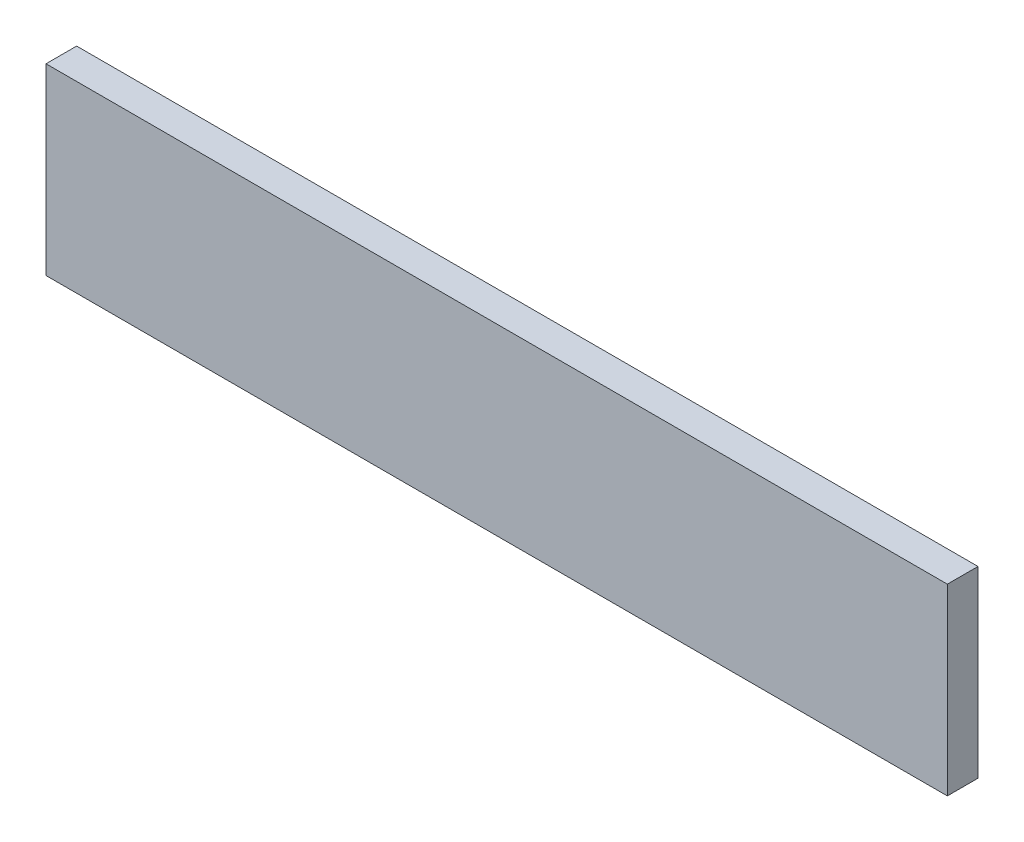
ISO-10303-21;
HEADER;
FILE_DESCRIPTION(('STEP AP214'),'2;1');
FILE_NAME('part.step','',(''),(''),'','','');
FILE_SCHEMA(('AUTOMOTIVE_DESIGN { 1 0 10303 214 1 1 1 1 }'));
ENDSEC;
DATA;
#1=APPLICATION_CONTEXT('core data for automotive mechanical design processes');
#2=APPLICATION_PROTOCOL_DEFINITION('international standard','automotive_design',2000,#1);
#3=PRODUCT_CONTEXT('',#1,'mechanical');
#4=PRODUCT('Part','Part','',(#3));
#5=PRODUCT_RELATED_PRODUCT_CATEGORY('part','',(#4));
#6=PRODUCT_DEFINITION_FORMATION('','',#4);
#7=PRODUCT_DEFINITION_CONTEXT('part definition',#1,'design');
#8=PRODUCT_DEFINITION('design','',#6,#7);
#9=PRODUCT_DEFINITION_SHAPE('','',#8);
#10=(LENGTH_UNIT() NAMED_UNIT(*) SI_UNIT(.MILLI.,.METRE.));
#11=(NAMED_UNIT(*) PLANE_ANGLE_UNIT() SI_UNIT($,.RADIAN.));
#12=(NAMED_UNIT(*) SI_UNIT($,.STERADIAN.) SOLID_ANGLE_UNIT());
#13=UNCERTAINTY_MEASURE_WITH_UNIT(LENGTH_MEASURE(1.E-05),#10,'distance_accuracy_value','');
#14=(GEOMETRIC_REPRESENTATION_CONTEXT(3) GLOBAL_UNCERTAINTY_ASSIGNED_CONTEXT((#13)) GLOBAL_UNIT_ASSIGNED_CONTEXT((#10,
#11,#12)) REPRESENTATION_CONTEXT('',''));
#15=CARTESIAN_POINT('',(0.,0.,0.));
#16=DIRECTION('',(0.,0.,1.));
#17=DIRECTION('',(1.,0.,0.));
#18=AXIS2_PLACEMENT_3D('',#15,#16,#17);
#19=CARTESIAN_POINT('',(-267.300605601993,-278.331336778386,10.));
#20=DIRECTION('',(1.,0.,0.));
#21=DIRECTION('',(0.,0.,-1.));
#22=AXIS2_PLACEMENT_3D('',#19,#20,#21);
#23=PLANE('',#22);
#24=DIRECTION('',(0.,-1.,0.));
#25=VECTOR('',#24,1.);
#26=CARTESIAN_POINT('',(-267.300605601993,-278.331336778386,0.));
#27=LINE('',#26,#25);
#28=CARTESIAN_POINT('',(-267.300605601993,-278.331336778386,0.));
#29=VERTEX_POINT('',#28);
#30=CARTESIAN_POINT('',(-267.300605601993,-338.157093727945,0.));
#31=VERTEX_POINT('',#30);
#32=EDGE_CURVE('E95',#29,#31,#27,.T.);
#33=ORIENTED_EDGE('',*,*,#32,.T.);
#34=DIRECTION('',(0.,0.,-1.));
#35=VECTOR('',#34,1.);
#36=CARTESIAN_POINT('',(-267.300605601993,-338.157093727945,10.));
#37=LINE('',#36,#35);
#38=CARTESIAN_POINT('',(-267.300605601993,-338.157093727945,10.));
#39=VERTEX_POINT('',#38);
#40=EDGE_CURVE('E11',#39,#31,#37,.T.);
#41=ORIENTED_EDGE('',*,*,#40,.F.);
#42=DIRECTION('',(0.,-1.,0.));
#43=VECTOR('',#42,1.);
#44=CARTESIAN_POINT('',(-267.300605601993,-278.331336778386,10.));
#45=LINE('',#44,#43);
#46=CARTESIAN_POINT('',(-267.300605601993,-278.331336778386,10.));
#47=VERTEX_POINT('',#46);
#48=EDGE_CURVE('E83',#47,#39,#45,.T.);
#49=ORIENTED_EDGE('',*,*,#48,.F.);
#50=DIRECTION('',(0.,0.,-1.));
#51=VECTOR('',#50,1.);
#52=CARTESIAN_POINT('',(-267.300605601993,-278.331336778386,10.));
#53=LINE('',#52,#51);
#54=EDGE_CURVE('E91',#47,#29,#53,.T.);
#55=ORIENTED_EDGE('',*,*,#54,.T.);
#56=EDGE_LOOP('',(#33,#41,#49,#55));
#57=FACE_BOUND('',#56,.T.);
#58=ADVANCED_FACE('F32',(#57),#23,.F.);
#59=CARTESIAN_POINT('',(-267.300605601993,-338.157093727945,10.));
#60=DIRECTION('',(0.,1.,0.));
#61=DIRECTION('',(0.,0.,1.));
#62=AXIS2_PLACEMENT_3D('',#59,#60,#61);
#63=PLANE('',#62);
#64=DIRECTION('',(1.,0.,0.));
#65=VECTOR('',#64,1.);
#66=CARTESIAN_POINT('',(-267.300605601993,-338.157093727945,0.));
#67=LINE('',#66,#65);
#68=CARTESIAN_POINT('',(26.6993943980066,-338.157093727945,0.));
#69=VERTEX_POINT('',#68);
#70=EDGE_CURVE('E87',#31,#69,#67,.T.);
#71=ORIENTED_EDGE('',*,*,#70,.T.);
#72=DIRECTION('',(0.,0.,-1.));
#73=VECTOR('',#72,1.);
#74=CARTESIAN_POINT('',(26.6993943980066,-338.157093727945,10.));
#75=LINE('',#74,#73);
#76=CARTESIAN_POINT('',(26.6993943980066,-338.157093727945,10.));
#77=VERTEX_POINT('',#76);
#78=EDGE_CURVE('E40',#77,#69,#75,.T.);
#79=ORIENTED_EDGE('',*,*,#78,.F.);
#80=DIRECTION('',(1.,0.,0.));
#81=VECTOR('',#80,1.);
#82=CARTESIAN_POINT('',(-267.300605601993,-338.157093727945,10.));
#83=LINE('',#82,#81);
#84=EDGE_CURVE('E78',#39,#77,#83,.T.);
#85=ORIENTED_EDGE('',*,*,#84,.F.);
#86=ORIENTED_EDGE('',*,*,#40,.T.);
#87=EDGE_LOOP('',(#71,#79,#85,#86));
#88=FACE_BOUND('',#87,.T.);
#89=ADVANCED_FACE('F86',(#88),#63,.F.);
#90=CARTESIAN_POINT('',(26.6993943980066,-278.331336778386,10.));
#91=DIRECTION('',(-1.,0.,0.));
#92=DIRECTION('',(0.,-1.,0.));
#93=AXIS2_PLACEMENT_3D('',#90,#91,#92);
#94=PLANE('',#93);
#95=DIRECTION('',(0.,1.,0.));
#96=VECTOR('',#95,1.);
#97=CARTESIAN_POINT('',(26.6993943980066,-278.331336778386,0.));
#98=LINE('',#97,#96);
#99=CARTESIAN_POINT('',(26.6993943980066,-278.331336778386,0.));
#100=VERTEX_POINT('',#99);
#101=EDGE_CURVE('E65',#69,#100,#98,.T.);
#102=ORIENTED_EDGE('',*,*,#101,.T.);
#103=DIRECTION('',(0.,0.,-1.));
#104=VECTOR('',#103,1.);
#105=CARTESIAN_POINT('',(26.6993943980066,-278.331336778386,10.));
#106=LINE('',#105,#104);
#107=CARTESIAN_POINT('',(26.6993943980066,-278.331336778386,10.));
#108=VERTEX_POINT('',#107);
#109=EDGE_CURVE('E88',#108,#100,#106,.T.);
#110=ORIENTED_EDGE('',*,*,#109,.F.);
#111=DIRECTION('',(0.,1.,0.));
#112=VECTOR('',#111,1.);
#113=CARTESIAN_POINT('',(26.6993943980066,-278.331336778386,10.));
#114=LINE('',#113,#112);
#115=EDGE_CURVE('E81',#77,#108,#114,.T.);
#116=ORIENTED_EDGE('',*,*,#115,.F.);
#117=ORIENTED_EDGE('',*,*,#78,.T.);
#118=EDGE_LOOP('',(#102,#110,#116,#117));
#119=FACE_BOUND('',#118,.T.);
#120=ADVANCED_FACE('F89',(#119),#94,.F.);
#121=CARTESIAN_POINT('',(-267.300605601993,-278.331336778386,10.));
#122=DIRECTION('',(0.,-1.,0.));
#123=DIRECTION('',(0.,0.,-1.));
#124=AXIS2_PLACEMENT_3D('',#121,#122,#123);
#125=PLANE('',#124);
#126=DIRECTION('',(-1.,0.,0.));
#127=VECTOR('',#126,1.);
#128=CARTESIAN_POINT('',(-267.300605601993,-278.331336778386,0.));
#129=LINE('',#128,#127);
#130=EDGE_CURVE('E71',#100,#29,#129,.T.);
#131=ORIENTED_EDGE('',*,*,#130,.T.);
#132=ORIENTED_EDGE('',*,*,#54,.F.);
#133=DIRECTION('',(-1.,0.,0.));
#134=VECTOR('',#133,1.);
#135=CARTESIAN_POINT('',(-267.300605601993,-278.331336778386,10.));
#136=LINE('',#135,#134);
#137=EDGE_CURVE('E48',#108,#47,#136,.T.);
#138=ORIENTED_EDGE('',*,*,#137,.F.);
#139=ORIENTED_EDGE('',*,*,#109,.T.);
#140=EDGE_LOOP('',(#131,#132,#138,#139));
#141=FACE_BOUND('',#140,.T.);
#142=ADVANCED_FACE('F102',(#141),#125,.F.);
#143=CARTESIAN_POINT('',(0.,0.,10.));
#144=DIRECTION('',(0.,0.,1.));
#145=DIRECTION('',(1.,0.,0.));
#146=AXIS2_PLACEMENT_3D('',#143,#144,#145);
#147=PLANE('',#146);
#148=ORIENTED_EDGE('',*,*,#48,.T.);
#149=ORIENTED_EDGE('',*,*,#84,.T.);
#150=ORIENTED_EDGE('',*,*,#115,.T.);
#151=ORIENTED_EDGE('',*,*,#137,.T.);
#152=EDGE_LOOP('',(#148,#149,#150,#151));
#153=FACE_BOUND('',#152,.T.);
#154=ADVANCED_FACE('F79',(#153),#147,.T.);
#155=CARTESIAN_POINT('',(0.,0.,0.));
#156=DIRECTION('',(0.,0.,1.));
#157=DIRECTION('',(1.,0.,0.));
#158=AXIS2_PLACEMENT_3D('',#155,#156,#157);
#159=PLANE('',#158);
#160=ORIENTED_EDGE('',*,*,#32,.F.);
#161=ORIENTED_EDGE('',*,*,#130,.F.);
#162=ORIENTED_EDGE('',*,*,#101,.F.);
#163=ORIENTED_EDGE('',*,*,#70,.F.);
#164=EDGE_LOOP('',(#160,#161,#162,#163));
#165=FACE_BOUND('',#164,.T.);
#166=ADVANCED_FACE('F105',(#165),#159,.F.);
#167=CLOSED_SHELL('',(#58,#89,#120,#142,#154,#166));
#168=MANIFOLD_SOLID_BREP('B2',#167);
#169=ADVANCED_BREP_SHAPE_REPRESENTATION('',(#18,#168),#14);
#170=SHAPE_DEFINITION_REPRESENTATION(#9,#169);
ENDSEC;
END-ISO-10303-21;
